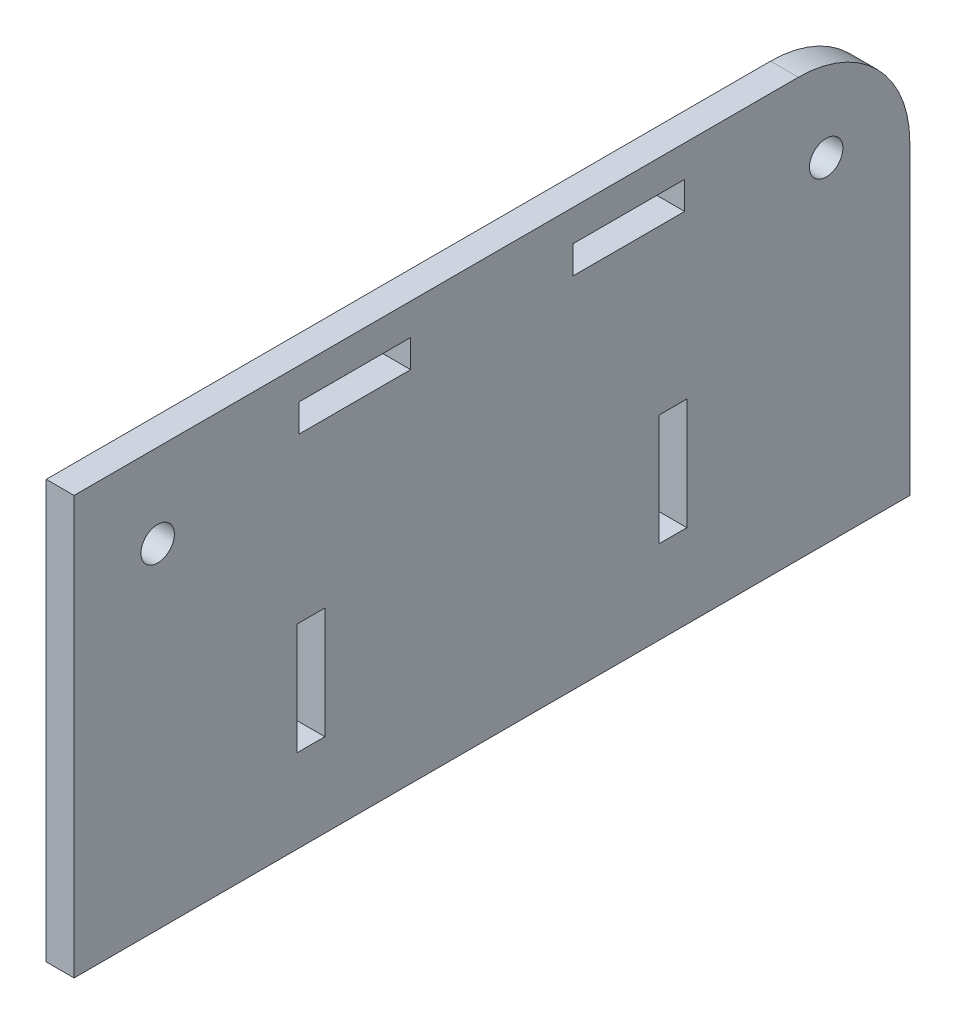
ISO-10303-21;
HEADER;
FILE_DESCRIPTION(('STEP AP214'),'2;1');
FILE_NAME('part.step','',(''),(''),'','','');
FILE_SCHEMA(('AUTOMOTIVE_DESIGN { 1 0 10303 214 1 1 1 1 }'));
ENDSEC;
DATA;
#1=APPLICATION_CONTEXT('core data for automotive mechanical design processes');
#2=APPLICATION_PROTOCOL_DEFINITION('international standard','automotive_design',2000,#1);
#3=PRODUCT_CONTEXT('',#1,'mechanical');
#4=PRODUCT('Part','Part','',(#3));
#5=PRODUCT_RELATED_PRODUCT_CATEGORY('part','',(#4));
#6=PRODUCT_DEFINITION_FORMATION('','',#4);
#7=PRODUCT_DEFINITION_CONTEXT('part definition',#1,'design');
#8=PRODUCT_DEFINITION('design','',#6,#7);
#9=PRODUCT_DEFINITION_SHAPE('','',#8);
#10=(LENGTH_UNIT() NAMED_UNIT(*) SI_UNIT(.MILLI.,.METRE.));
#11=(NAMED_UNIT(*) PLANE_ANGLE_UNIT() SI_UNIT($,.RADIAN.));
#12=(NAMED_UNIT(*) SI_UNIT($,.STERADIAN.) SOLID_ANGLE_UNIT());
#13=UNCERTAINTY_MEASURE_WITH_UNIT(LENGTH_MEASURE(1.E-05),#10,'distance_accuracy_value','');
#14=(GEOMETRIC_REPRESENTATION_CONTEXT(3) GLOBAL_UNCERTAINTY_ASSIGNED_CONTEXT((#13)) GLOBAL_UNIT_ASSIGNED_CONTEXT((#10,
#11,#12)) REPRESENTATION_CONTEXT('',''));
#15=CARTESIAN_POINT('',(0.,0.,0.));
#16=DIRECTION('',(0.,0.,1.));
#17=DIRECTION('',(1.,0.,0.));
#18=AXIS2_PLACEMENT_3D('',#15,#16,#17);
#19=CARTESIAN_POINT('',(5.,17.5106814537718,-24.6166503870736));
#20=DIRECTION('',(-1.,0.,0.));
#21=DIRECTION('',(0.,0.,1.));
#22=AXIS2_PLACEMENT_3D('',#19,#20,#21);
#23=PLANE('',#22);
#24=DIRECTION('',(0.,0.,-1.));
#25=VECTOR('',#24,1.);
#26=CARTESIAN_POINT('',(5.,26.8517441883896,44.981036282061));
#27=LINE('',#26,#25);
#28=CARTESIAN_POINT('',(5.,26.8517441883896,64.9867330574059));
#29=VERTEX_POINT('',#28);
#30=CARTESIAN_POINT('',(5.,26.8517441883896,44.981036282061));
#31=VERTEX_POINT('',#30);
#32=EDGE_CURVE('E214',#29,#31,#27,.T.);
#33=ORIENTED_EDGE('',*,*,#32,.F.);
#34=DIRECTION('',(0.,-1.,0.));
#35=VECTOR('',#34,1.);
#36=CARTESIAN_POINT('',(5.,26.8517441883896,64.9867330574059));
#37=LINE('',#36,#35);
#38=CARTESIAN_POINT('',(5.,31.8531683822259,64.986733057406));
#39=VERTEX_POINT('',#38);
#40=EDGE_CURVE('E222',#39,#29,#37,.T.);
#41=ORIENTED_EDGE('',*,*,#40,.F.);
#42=DIRECTION('',(0.,0.,1.));
#43=VECTOR('',#42,1.);
#44=CARTESIAN_POINT('',(5.,31.8531683822259,64.986733057406));
#45=LINE('',#44,#43);
#46=CARTESIAN_POINT('',(5.,31.8531683822259,44.981036282061));
#47=VERTEX_POINT('',#46);
#48=EDGE_CURVE('E219',#47,#39,#45,.T.);
#49=ORIENTED_EDGE('',*,*,#48,.F.);
#50=DIRECTION('',(0.,1.,0.));
#51=VECTOR('',#50,1.);
#52=CARTESIAN_POINT('',(5.,31.8531683822259,44.981036282061));
#53=LINE('',#52,#51);
#54=EDGE_CURVE('E216',#31,#47,#53,.T.);
#55=ORIENTED_EDGE('',*,*,#54,.F.);
#56=EDGE_LOOP('',(#33,#41,#49,#55));
#57=FACE_BOUND('',#56,.T.);
#58=DIRECTION('',(0.,0.,1.));
#59=VECTOR('',#58,1.);
#60=CARTESIAN_POINT('',(5.,-2.50071209691811,0.396167357452658));
#61=LINE('',#60,#59);
#62=CARTESIAN_POINT('',(5.,-2.50071209691811,-4.60525683638359));
#63=VERTEX_POINT('',#62);
#64=CARTESIAN_POINT('',(5.,-2.50071209691811,0.396167357452658));
#65=VERTEX_POINT('',#64);
#66=EDGE_CURVE('E282',#63,#65,#61,.T.);
#67=ORIENTED_EDGE('',*,*,#66,.F.);
#68=DIRECTION('',(0.,1.,0.));
#69=VECTOR('',#68,1.);
#70=CARTESIAN_POINT('',(5.,-2.50071209691811,-4.60525683638359));
#71=LINE('',#70,#69);
#72=CARTESIAN_POINT('',(5.,-22.5064088722631,-4.60525683638356));
#73=VERTEX_POINT('',#72);
#74=EDGE_CURVE('E290',#73,#63,#71,.T.);
#75=ORIENTED_EDGE('',*,*,#74,.F.);
#76=DIRECTION('',(0.,0.,-1.));
#77=VECTOR('',#76,1.);
#78=CARTESIAN_POINT('',(5.,-22.5064088722631,-4.60525683638356));
#79=LINE('',#78,#77);
#80=CARTESIAN_POINT('',(5.,-22.5064088722631,0.396167357452686));
#81=VERTEX_POINT('',#80);
#82=EDGE_CURVE('E287',#81,#73,#79,.T.);
#83=ORIENTED_EDGE('',*,*,#82,.F.);
#84=DIRECTION('',(0.,-1.,0.));
#85=VECTOR('',#84,1.);
#86=CARTESIAN_POINT('',(5.,-22.5064088722631,0.396167357452686));
#87=LINE('',#86,#85);
#88=EDGE_CURVE('E284',#65,#81,#87,.T.);
#89=ORIENTED_EDGE('',*,*,#88,.F.);
#90=EDGE_LOOP('',(#67,#75,#83,#89));
#91=FACE_BOUND('',#90,.T.);
#92=CARTESIAN_POINT('',(5.,17.5106814537718,-24.6166503870736));
#93=DIRECTION('',(1.,0.,0.));
#94=DIRECTION('',(0.,0.,1.));
#95=AXIS2_PLACEMENT_3D('',#92,#93,#94);
#96=CIRCLE('',#95,20.);
#97=CARTESIAN_POINT('',(5.,17.5106814537717,-44.6166503870735));
#98=VERTEX_POINT('',#97);
#99=CARTESIAN_POINT('',(5.,37.5106814537718,-24.6166503870734));
#100=VERTEX_POINT('',#99);
#101=EDGE_CURVE('E319',#98,#100,#96,.T.);
#102=ORIENTED_EDGE('',*,*,#101,.T.);
#103=DIRECTION('',(0.,0.,1.));
#104=VECTOR('',#103,1.);
#105=CARTESIAN_POINT('',(5.,37.5106814537718,-24.6166503870734));
#106=LINE('',#105,#104);
#107=CARTESIAN_POINT('',(5.,37.5106814537718,105.391894775944));
#108=VERTEX_POINT('',#107);
#109=EDGE_CURVE('E322',#100,#108,#106,.T.);
#110=ORIENTED_EDGE('',*,*,#109,.T.);
#111=DIRECTION('',(0.,-1.,0.));
#112=VECTOR('',#111,1.);
#113=CARTESIAN_POINT('',(5.,-37.5106814537718,105.391894775944));
#114=LINE('',#113,#112);
#115=CARTESIAN_POINT('',(5.,-37.5106814537718,105.391894775944));
#116=VERTEX_POINT('',#115);
#117=EDGE_CURVE('E325',#108,#116,#114,.T.);
#118=ORIENTED_EDGE('',*,*,#117,.T.);
#119=DIRECTION('',(0.,0.,-1.));
#120=VECTOR('',#119,1.);
#121=CARTESIAN_POINT('',(5.,-37.5106814537718,105.391894775944));
#122=LINE('',#121,#120);
#123=CARTESIAN_POINT('',(5.,-37.5106814537718,-44.6166503870735));
#124=VERTEX_POINT('',#123);
#125=EDGE_CURVE('E327',#116,#124,#122,.T.);
#126=ORIENTED_EDGE('',*,*,#125,.T.);
#127=DIRECTION('',(0.,1.,0.));
#128=VECTOR('',#127,1.);
#129=CARTESIAN_POINT('',(5.,-37.5106814537718,-44.6166503870735));
#130=LINE('',#129,#128);
#131=EDGE_CURVE('E329',#124,#98,#130,.T.);
#132=ORIENTED_EDGE('',*,*,#131,.T.);
#133=EDGE_LOOP('',(#102,#110,#118,#126,#132));
#134=FACE_BOUND('',#133,.T.);
#135=CARTESIAN_POINT('',(5.,22.5064088722631,-29.6123778055648));
#136=DIRECTION('',(1.,0.,0.));
#137=DIRECTION('',(0.,0.,-1.));
#138=AXIS2_PLACEMENT_3D('',#135,#136,#137);
#139=CIRCLE('',#138,3.00085451630174);
#140=CARTESIAN_POINT('',(5.,22.5064088722631,-32.6132323218665));
#141=VERTEX_POINT('',#140);
#142=EDGE_CURVE('E313',#141,#141,#139,.T.);
#143=ORIENTED_EDGE('',*,*,#142,.F.);
#144=EDGE_LOOP('',(#143));
#145=FACE_BOUND('',#144,.T.);
#146=DIRECTION('',(0.,0.,1.));
#147=VECTOR('',#146,1.);
#148=CARTESIAN_POINT('',(5.,31.8531683822259,-4.2114886685356));
#149=LINE('',#148,#147);
#150=CARTESIAN_POINT('',(5.,31.8531683822259,-4.2114886685356));
#151=VERTEX_POINT('',#150);
#152=CARTESIAN_POINT('',(5.,31.8531683822259,15.7942081068094));
#153=VERTEX_POINT('',#152);
#154=EDGE_CURVE('E251',#151,#153,#149,.T.);
#155=ORIENTED_EDGE('',*,*,#154,.F.);
#156=DIRECTION('',(0.,1.,0.));
#157=VECTOR('',#156,1.);
#158=CARTESIAN_POINT('',(5.,26.8517441883896,-4.21148866853557));
#159=LINE('',#158,#157);
#160=CARTESIAN_POINT('',(5.,26.8517441883896,-4.21148866853557));
#161=VERTEX_POINT('',#160);
#162=EDGE_CURVE('E259',#161,#151,#159,.T.);
#163=ORIENTED_EDGE('',*,*,#162,.F.);
#164=DIRECTION('',(0.,0.,-1.));
#165=VECTOR('',#164,1.);
#166=CARTESIAN_POINT('',(5.,26.8517441883896,15.7942081068094));
#167=LINE('',#166,#165);
#168=CARTESIAN_POINT('',(5.,26.8517441883896,15.7942081068094));
#169=VERTEX_POINT('',#168);
#170=EDGE_CURVE('E256',#169,#161,#167,.T.);
#171=ORIENTED_EDGE('',*,*,#170,.F.);
#172=DIRECTION('',(0.,-1.,0.));
#173=VECTOR('',#172,1.);
#174=CARTESIAN_POINT('',(5.,31.8531683822259,15.7942081068094));
#175=LINE('',#174,#173);
#176=EDGE_CURVE('E253',#153,#169,#175,.T.);
#177=ORIENTED_EDGE('',*,*,#176,.F.);
#178=EDGE_LOOP('',(#155,#163,#171,#177));
#179=FACE_BOUND('',#178,.T.);
#180=CARTESIAN_POINT('',(5.,22.5064088722631,90.3876221944352));
#181=DIRECTION('',(1.,0.,0.));
#182=DIRECTION('',(0.,0.,1.));
#183=AXIS2_PLACEMENT_3D('',#180,#181,#182);
#184=CIRCLE('',#183,3.00085451630174);
#185=CARTESIAN_POINT('',(5.,22.5064088722631,93.3884767107369));
#186=VERTEX_POINT('',#185);
#187=EDGE_CURVE('E245',#186,#186,#184,.T.);
#188=ORIENTED_EDGE('',*,*,#187,.F.);
#189=EDGE_LOOP('',(#188));
#190=FACE_BOUND('',#189,.T.);
#191=DIRECTION('',(0.,1.,0.));
#192=VECTOR('',#191,1.);
#193=CARTESIAN_POINT('',(5.,-22.5064088722631,60.3790770314177));
#194=LINE('',#193,#192);
#195=CARTESIAN_POINT('',(5.,-22.5064088722631,60.3790770314177));
#196=VERTEX_POINT('',#195);
#197=CARTESIAN_POINT('',(5.,-2.50071209691811,60.3790770314177));
#198=VERTEX_POINT('',#197);
#199=EDGE_CURVE('E178',#196,#198,#194,.T.);
#200=ORIENTED_EDGE('',*,*,#199,.F.);
#201=DIRECTION('',(0.,0.,-1.));
#202=VECTOR('',#201,1.);
#203=CARTESIAN_POINT('',(5.,-22.5064088722631,65.3805012252539));
#204=LINE('',#203,#202);
#205=CARTESIAN_POINT('',(5.,-22.5064088722631,65.3805012252539));
#206=VERTEX_POINT('',#205);
#207=EDGE_CURVE('E200',#206,#196,#204,.T.);
#208=ORIENTED_EDGE('',*,*,#207,.F.);
#209=DIRECTION('',(0.,-1.,0.));
#210=VECTOR('',#209,1.);
#211=CARTESIAN_POINT('',(5.,-2.50071209691811,65.380501225254));
#212=LINE('',#211,#210);
#213=CARTESIAN_POINT('',(5.,-2.50071209691811,65.380501225254));
#214=VERTEX_POINT('',#213);
#215=EDGE_CURVE('E198',#214,#206,#212,.T.);
#216=ORIENTED_EDGE('',*,*,#215,.F.);
#217=DIRECTION('',(0.,0.,1.));
#218=VECTOR('',#217,1.);
#219=CARTESIAN_POINT('',(5.,-2.50071209691811,60.3790770314177));
#220=LINE('',#219,#218);
#221=EDGE_CURVE('E186',#198,#214,#220,.T.);
#222=ORIENTED_EDGE('',*,*,#221,.F.);
#223=EDGE_LOOP('',(#200,#208,#216,#222));
#224=FACE_BOUND('',#223,.T.);
#225=ADVANCED_FACE('F35',(#57,#91,#134,#145,#179,#190,#224),#23,.F.);
#226=CARTESIAN_POINT('',(0.,17.5106814537718,-24.6166503870736));
#227=DIRECTION('',(-1.,0.,0.));
#228=DIRECTION('',(0.,0.,1.));
#229=AXIS2_PLACEMENT_3D('',#226,#227,#228);
#230=PLANE('',#229);
#231=DIRECTION('',(0.,1.,0.));
#232=VECTOR('',#231,1.);
#233=CARTESIAN_POINT('',(0.,26.8517441883896,-4.21148866853557));
#234=LINE('',#233,#232);
#235=CARTESIAN_POINT('',(0.,26.8517441883896,-4.21148866853557));
#236=VERTEX_POINT('',#235);
#237=CARTESIAN_POINT('',(0.,31.8531683822259,-4.2114886685356));
#238=VERTEX_POINT('',#237);
#239=EDGE_CURVE('E254',#236,#238,#234,.T.);
#240=ORIENTED_EDGE('',*,*,#239,.T.);
#241=DIRECTION('',(0.,0.,1.));
#242=VECTOR('',#241,1.);
#243=CARTESIAN_POINT('',(0.,31.8531683822259,-4.2114886685356));
#244=LINE('',#243,#242);
#245=CARTESIAN_POINT('',(0.,31.8531683822259,15.7942081068094));
#246=VERTEX_POINT('',#245);
#247=EDGE_CURVE('E248',#238,#246,#244,.T.);
#248=ORIENTED_EDGE('',*,*,#247,.T.);
#249=DIRECTION('',(0.,-1.,0.));
#250=VECTOR('',#249,1.);
#251=CARTESIAN_POINT('',(0.,31.8531683822259,15.7942081068094));
#252=LINE('',#251,#250);
#253=CARTESIAN_POINT('',(0.,26.8517441883896,15.7942081068094));
#254=VERTEX_POINT('',#253);
#255=EDGE_CURVE('E264',#246,#254,#252,.T.);
#256=ORIENTED_EDGE('',*,*,#255,.T.);
#257=DIRECTION('',(0.,0.,-1.));
#258=VECTOR('',#257,1.);
#259=CARTESIAN_POINT('',(0.,26.8517441883896,15.7942081068094));
#260=LINE('',#259,#258);
#261=EDGE_CURVE('E267',#254,#236,#260,.T.);
#262=ORIENTED_EDGE('',*,*,#261,.T.);
#263=EDGE_LOOP('',(#240,#248,#256,#262));
#264=FACE_BOUND('',#263,.T.);
#265=DIRECTION('',(0.,1.,0.));
#266=VECTOR('',#265,1.);
#267=CARTESIAN_POINT('',(0.,-2.50071209691811,-4.60525683638359));
#268=LINE('',#267,#266);
#269=CARTESIAN_POINT('',(0.,-22.5064088722631,-4.60525683638356));
#270=VERTEX_POINT('',#269);
#271=CARTESIAN_POINT('',(0.,-2.50071209691811,-4.60525683638359));
#272=VERTEX_POINT('',#271);
#273=EDGE_CURVE('E285',#270,#272,#268,.T.);
#274=ORIENTED_EDGE('',*,*,#273,.T.);
#275=DIRECTION('',(0.,0.,1.));
#276=VECTOR('',#275,1.);
#277=CARTESIAN_POINT('',(0.,-2.50071209691811,0.396167357452658));
#278=LINE('',#277,#276);
#279=CARTESIAN_POINT('',(0.,-2.50071209691811,0.396167357452658));
#280=VERTEX_POINT('',#279);
#281=EDGE_CURVE('E281',#272,#280,#278,.T.);
#282=ORIENTED_EDGE('',*,*,#281,.T.);
#283=DIRECTION('',(0.,-1.,0.));
#284=VECTOR('',#283,1.);
#285=CARTESIAN_POINT('',(0.,-22.5064088722631,0.396167357452686));
#286=LINE('',#285,#284);
#287=CARTESIAN_POINT('',(0.,-22.5064088722631,0.396167357452686));
#288=VERTEX_POINT('',#287);
#289=EDGE_CURVE('E295',#280,#288,#286,.T.);
#290=ORIENTED_EDGE('',*,*,#289,.T.);
#291=DIRECTION('',(0.,0.,-1.));
#292=VECTOR('',#291,1.);
#293=CARTESIAN_POINT('',(0.,-22.5064088722631,-4.60525683638356));
#294=LINE('',#293,#292);
#295=EDGE_CURVE('E298',#288,#270,#294,.T.);
#296=ORIENTED_EDGE('',*,*,#295,.T.);
#297=EDGE_LOOP('',(#274,#282,#290,#296));
#298=FACE_BOUND('',#297,.T.);
#299=CARTESIAN_POINT('',(0.,22.5064088722631,-29.6123778055648));
#300=DIRECTION('',(1.,0.,0.));
#301=DIRECTION('',(0.,0.,-1.));
#302=AXIS2_PLACEMENT_3D('',#299,#300,#301);
#303=CIRCLE('',#302,3.00085451630174);
#304=CARTESIAN_POINT('',(0.,22.5064088722631,-32.6132323218665));
#305=VERTEX_POINT('',#304);
#306=EDGE_CURVE('E312',#305,#305,#303,.T.);
#307=ORIENTED_EDGE('',*,*,#306,.T.);
#308=EDGE_LOOP('',(#307));
#309=FACE_BOUND('',#308,.T.);
#310=CARTESIAN_POINT('',(0.,17.5106814537718,-24.6166503870736));
#311=DIRECTION('',(1.,0.,0.));
#312=DIRECTION('',(0.,0.,1.));
#313=AXIS2_PLACEMENT_3D('',#310,#311,#312);
#314=CIRCLE('',#313,20.);
#315=CARTESIAN_POINT('',(0.,17.5106814537717,-44.6166503870735));
#316=VERTEX_POINT('',#315);
#317=CARTESIAN_POINT('',(0.,37.5106814537718,-24.6166503870734));
#318=VERTEX_POINT('',#317);
#319=EDGE_CURVE('E316',#316,#318,#314,.T.);
#320=ORIENTED_EDGE('',*,*,#319,.F.);
#321=DIRECTION('',(0.,1.,0.));
#322=VECTOR('',#321,1.);
#323=CARTESIAN_POINT('',(0.,-37.5106814537718,-44.6166503870735));
#324=LINE('',#323,#322);
#325=CARTESIAN_POINT('',(0.,-37.5106814537718,-44.6166503870735));
#326=VERTEX_POINT('',#325);
#327=EDGE_CURVE('E323',#326,#316,#324,.T.);
#328=ORIENTED_EDGE('',*,*,#327,.F.);
#329=DIRECTION('',(0.,0.,-1.));
#330=VECTOR('',#329,1.);
#331=CARTESIAN_POINT('',(0.,-37.5106814537718,105.391894775944));
#332=LINE('',#331,#330);
#333=CARTESIAN_POINT('',(0.,-37.5106814537718,105.391894775944));
#334=VERTEX_POINT('',#333);
#335=EDGE_CURVE('E338',#334,#326,#332,.T.);
#336=ORIENTED_EDGE('',*,*,#335,.F.);
#337=DIRECTION('',(0.,-1.,0.));
#338=VECTOR('',#337,1.);
#339=CARTESIAN_POINT('',(0.,-37.5106814537718,105.391894775944));
#340=LINE('',#339,#338);
#341=CARTESIAN_POINT('',(0.,37.5106814537718,105.391894775944));
#342=VERTEX_POINT('',#341);
#343=EDGE_CURVE('E336',#342,#334,#340,.T.);
#344=ORIENTED_EDGE('',*,*,#343,.F.);
#345=DIRECTION('',(0.,0.,1.));
#346=VECTOR('',#345,1.);
#347=CARTESIAN_POINT('',(0.,37.5106814537718,-24.6166503870734));
#348=LINE('',#347,#346);
#349=EDGE_CURVE('E334',#318,#342,#348,.T.);
#350=ORIENTED_EDGE('',*,*,#349,.F.);
#351=EDGE_LOOP('',(#320,#328,#336,#344,#350));
#352=FACE_BOUND('',#351,.T.);
#353=CARTESIAN_POINT('',(0.,22.5064088722631,90.3876221944352));
#354=DIRECTION('',(1.,0.,0.));
#355=DIRECTION('',(0.,0.,1.));
#356=AXIS2_PLACEMENT_3D('',#353,#354,#355);
#357=CIRCLE('',#356,3.00085451630174);
#358=CARTESIAN_POINT('',(0.,22.5064088722631,93.3884767107369));
#359=VERTEX_POINT('',#358);
#360=EDGE_CURVE('E244',#359,#359,#357,.T.);
#361=ORIENTED_EDGE('',*,*,#360,.T.);
#362=EDGE_LOOP('',(#361));
#363=FACE_BOUND('',#362,.T.);
#364=DIRECTION('',(0.,-1.,0.));
#365=VECTOR('',#364,1.);
#366=CARTESIAN_POINT('',(0.,26.8517441883896,64.9867330574059));
#367=LINE('',#366,#365);
#368=CARTESIAN_POINT('',(0.,31.8531683822259,64.986733057406));
#369=VERTEX_POINT('',#368);
#370=CARTESIAN_POINT('',(0.,26.8517441883896,64.9867330574059));
#371=VERTEX_POINT('',#370);
#372=EDGE_CURVE('E217',#369,#371,#367,.T.);
#373=ORIENTED_EDGE('',*,*,#372,.T.);
#374=DIRECTION('',(0.,0.,-1.));
#375=VECTOR('',#374,1.);
#376=CARTESIAN_POINT('',(0.,26.8517441883896,44.981036282061));
#377=LINE('',#376,#375);
#378=CARTESIAN_POINT('',(0.,26.8517441883896,44.981036282061));
#379=VERTEX_POINT('',#378);
#380=EDGE_CURVE('E194',#371,#379,#377,.T.);
#381=ORIENTED_EDGE('',*,*,#380,.T.);
#382=DIRECTION('',(0.,1.,0.));
#383=VECTOR('',#382,1.);
#384=CARTESIAN_POINT('',(0.,31.8531683822259,44.981036282061));
#385=LINE('',#384,#383);
#386=CARTESIAN_POINT('',(0.,31.8531683822259,44.981036282061));
#387=VERTEX_POINT('',#386);
#388=EDGE_CURVE('E227',#379,#387,#385,.T.);
#389=ORIENTED_EDGE('',*,*,#388,.T.);
#390=DIRECTION('',(0.,0.,1.));
#391=VECTOR('',#390,1.);
#392=CARTESIAN_POINT('',(0.,31.8531683822259,64.986733057406));
#393=LINE('',#392,#391);
#394=EDGE_CURVE('E230',#387,#369,#393,.T.);
#395=ORIENTED_EDGE('',*,*,#394,.T.);
#396=EDGE_LOOP('',(#373,#381,#389,#395));
#397=FACE_BOUND('',#396,.T.);
#398=DIRECTION('',(0.,0.,-1.));
#399=VECTOR('',#398,1.);
#400=CARTESIAN_POINT('',(0.,-22.5064088722631,65.3805012252539));
#401=LINE('',#400,#399);
#402=CARTESIAN_POINT('',(0.,-22.5064088722631,65.3805012252539));
#403=VERTEX_POINT('',#402);
#404=CARTESIAN_POINT('',(0.,-22.5064088722631,60.3790770314177));
#405=VERTEX_POINT('',#404);
#406=EDGE_CURVE('E187',#403,#405,#401,.T.);
#407=ORIENTED_EDGE('',*,*,#406,.T.);
#408=DIRECTION('',(0.,1.,0.));
#409=VECTOR('',#408,1.);
#410=CARTESIAN_POINT('',(0.,-22.5064088722631,60.3790770314177));
#411=LINE('',#410,#409);
#412=CARTESIAN_POINT('',(0.,-2.50071209691811,60.3790770314177));
#413=VERTEX_POINT('',#412);
#414=EDGE_CURVE('E58',#405,#413,#411,.T.);
#415=ORIENTED_EDGE('',*,*,#414,.T.);
#416=DIRECTION('',(0.,0.,1.));
#417=VECTOR('',#416,1.);
#418=CARTESIAN_POINT('',(0.,-2.50071209691811,60.3790770314177));
#419=LINE('',#418,#417);
#420=CARTESIAN_POINT('',(0.,-2.50071209691811,65.380501225254));
#421=VERTEX_POINT('',#420);
#422=EDGE_CURVE('E193',#413,#421,#419,.T.);
#423=ORIENTED_EDGE('',*,*,#422,.T.);
#424=DIRECTION('',(0.,-1.,0.));
#425=VECTOR('',#424,1.);
#426=CARTESIAN_POINT('',(0.,-2.50071209691811,65.380501225254));
#427=LINE('',#426,#425);
#428=EDGE_CURVE('E206',#421,#403,#427,.T.);
#429=ORIENTED_EDGE('',*,*,#428,.T.);
#430=EDGE_LOOP('',(#407,#415,#423,#429));
#431=FACE_BOUND('',#430,.T.);
#432=ADVANCED_FACE('F359',(#264,#298,#309,#352,#363,#397,#431),#230,.T.);
#433=CARTESIAN_POINT('',(5.,17.5106814537718,-24.6166503870736));
#434=DIRECTION('',(-1.,0.,0.));
#435=DIRECTION('',(0.,0.,1.));
#436=AXIS2_PLACEMENT_3D('',#433,#434,#435);
#437=CYLINDRICAL_SURFACE('',#436,20.);
#438=ORIENTED_EDGE('',*,*,#319,.T.);
#439=DIRECTION('',(-1.,0.,0.));
#440=VECTOR('',#439,1.);
#441=CARTESIAN_POINT('',(5.,37.5106814537718,-24.6166503870734));
#442=LINE('',#441,#440);
#443=EDGE_CURVE('E11',#100,#318,#442,.T.);
#444=ORIENTED_EDGE('',*,*,#443,.F.);
#445=ORIENTED_EDGE('',*,*,#101,.F.);
#446=DIRECTION('',(-1.,0.,0.));
#447=VECTOR('',#446,1.);
#448=CARTESIAN_POINT('',(5.,17.5106814537717,-44.6166503870735));
#449=LINE('',#448,#447);
#450=EDGE_CURVE('E331',#98,#316,#449,.T.);
#451=ORIENTED_EDGE('',*,*,#450,.T.);
#452=EDGE_LOOP('',(#438,#444,#445,#451));
#453=FACE_BOUND('',#452,.T.);
#454=ADVANCED_FACE('F37',(#453),#437,.T.);
#455=CARTESIAN_POINT('',(5.,37.5106814537718,-24.6166503870734));
#456=DIRECTION('',(0.,-1.,0.));
#457=DIRECTION('',(0.,0.,-1.));
#458=AXIS2_PLACEMENT_3D('',#455,#456,#457);
#459=PLANE('',#458);
#460=ORIENTED_EDGE('',*,*,#349,.T.);
#461=DIRECTION('',(-1.,0.,0.));
#462=VECTOR('',#461,1.);
#463=CARTESIAN_POINT('',(5.,37.5106814537718,105.391894775944));
#464=LINE('',#463,#462);
#465=EDGE_CURVE('E43',#108,#342,#464,.T.);
#466=ORIENTED_EDGE('',*,*,#465,.F.);
#467=ORIENTED_EDGE('',*,*,#109,.F.);
#468=ORIENTED_EDGE('',*,*,#443,.T.);
#469=EDGE_LOOP('',(#460,#466,#467,#468));
#470=FACE_BOUND('',#469,.T.);
#471=ADVANCED_FACE('F374',(#470),#459,.F.);
#472=CARTESIAN_POINT('',(5.,-37.5106814537718,105.391894775944));
#473=DIRECTION('',(0.,0.,-1.));
#474=DIRECTION('',(-1.,0.,0.));
#475=AXIS2_PLACEMENT_3D('',#472,#473,#474);
#476=PLANE('',#475);
#477=ORIENTED_EDGE('',*,*,#343,.T.);
#478=DIRECTION('',(-1.,0.,0.));
#479=VECTOR('',#478,1.);
#480=CARTESIAN_POINT('',(5.,-37.5106814537718,105.391894775944));
#481=LINE('',#480,#479);
#482=EDGE_CURVE('E346',#116,#334,#481,.T.);
#483=ORIENTED_EDGE('',*,*,#482,.F.);
#484=ORIENTED_EDGE('',*,*,#117,.F.);
#485=ORIENTED_EDGE('',*,*,#465,.T.);
#486=EDGE_LOOP('',(#477,#483,#484,#485));
#487=FACE_BOUND('',#486,.T.);
#488=ADVANCED_FACE('F353',(#487),#476,.F.);
#489=CARTESIAN_POINT('',(5.,-37.5106814537718,105.391894775944));
#490=DIRECTION('',(0.,1.,0.));
#491=DIRECTION('',(0.,0.,1.));
#492=AXIS2_PLACEMENT_3D('',#489,#490,#491);
#493=PLANE('',#492);
#494=ORIENTED_EDGE('',*,*,#335,.T.);
#495=DIRECTION('',(-1.,0.,0.));
#496=VECTOR('',#495,1.);
#497=CARTESIAN_POINT('',(5.,-37.5106814537718,-44.6166503870735));
#498=LINE('',#497,#496);
#499=EDGE_CURVE('E343',#124,#326,#498,.T.);
#500=ORIENTED_EDGE('',*,*,#499,.F.);
#501=ORIENTED_EDGE('',*,*,#125,.F.);
#502=ORIENTED_EDGE('',*,*,#482,.T.);
#503=EDGE_LOOP('',(#494,#500,#501,#502));
#504=FACE_BOUND('',#503,.T.);
#505=ADVANCED_FACE('F364',(#504),#493,.F.);
#506=CARTESIAN_POINT('',(5.,-37.5106814537718,-44.6166503870735));
#507=DIRECTION('',(0.,0.,1.));
#508=DIRECTION('',(1.,0.,0.));
#509=AXIS2_PLACEMENT_3D('',#506,#507,#508);
#510=PLANE('',#509);
#511=ORIENTED_EDGE('',*,*,#327,.T.);
#512=ORIENTED_EDGE('',*,*,#450,.F.);
#513=ORIENTED_EDGE('',*,*,#131,.F.);
#514=ORIENTED_EDGE('',*,*,#499,.T.);
#515=EDGE_LOOP('',(#511,#512,#513,#514));
#516=FACE_BOUND('',#515,.T.);
#517=ADVANCED_FACE('F368',(#516),#510,.F.);
#518=CARTESIAN_POINT('',(5.,22.5064088722631,-29.6123778055648));
#519=DIRECTION('',(-1.,0.,0.));
#520=DIRECTION('',(0.,0.,1.));
#521=AXIS2_PLACEMENT_3D('',#518,#519,#520);
#522=CYLINDRICAL_SURFACE('',#521,3.00085451630174);
#523=ORIENTED_EDGE('',*,*,#142,.T.);
#524=EDGE_LOOP('',(#523));
#525=FACE_BOUND('',#524,.T.);
#526=ORIENTED_EDGE('',*,*,#306,.F.);
#527=EDGE_LOOP('',(#526));
#528=FACE_BOUND('',#527,.T.);
#529=ADVANCED_FACE('F391',(#525,#528),#522,.F.);
#530=CARTESIAN_POINT('',(5.,-2.50071209691811,0.396167357452658));
#531=DIRECTION('',(0.,-1.,0.));
#532=DIRECTION('',(0.,0.,-1.));
#533=AXIS2_PLACEMENT_3D('',#530,#531,#532);
#534=PLANE('',#533);
#535=ORIENTED_EDGE('',*,*,#281,.F.);
#536=DIRECTION('',(-1.,0.,0.));
#537=VECTOR('',#536,1.);
#538=CARTESIAN_POINT('',(5.,-2.50071209691811,-4.60525683638359));
#539=LINE('',#538,#537);
#540=EDGE_CURVE('E292',#63,#272,#539,.T.);
#541=ORIENTED_EDGE('',*,*,#540,.F.);
#542=ORIENTED_EDGE('',*,*,#66,.T.);
#543=DIRECTION('',(-1.,0.,0.));
#544=VECTOR('',#543,1.);
#545=CARTESIAN_POINT('',(5.,-2.50071209691811,0.396167357452658));
#546=LINE('',#545,#544);
#547=EDGE_CURVE('E309',#65,#280,#546,.T.);
#548=ORIENTED_EDGE('',*,*,#547,.T.);
#549=EDGE_LOOP('',(#535,#541,#542,#548));
#550=FACE_BOUND('',#549,.T.);
#551=ADVANCED_FACE('F417',(#550),#534,.T.);
#552=CARTESIAN_POINT('',(5.,-22.5064088722631,0.396167357452686));
#553=DIRECTION('',(0.,0.,-1.));
#554=DIRECTION('',(0.,1.,0.));
#555=AXIS2_PLACEMENT_3D('',#552,#553,#554);
#556=PLANE('',#555);
#557=ORIENTED_EDGE('',*,*,#289,.F.);
#558=ORIENTED_EDGE('',*,*,#547,.F.);
#559=ORIENTED_EDGE('',*,*,#88,.T.);
#560=DIRECTION('',(-1.,0.,0.));
#561=VECTOR('',#560,1.);
#562=CARTESIAN_POINT('',(5.,-22.5064088722631,0.396167357452686));
#563=LINE('',#562,#561);
#564=EDGE_CURVE('E307',#81,#288,#563,.T.);
#565=ORIENTED_EDGE('',*,*,#564,.T.);
#566=EDGE_LOOP('',(#557,#558,#559,#565));
#567=FACE_BOUND('',#566,.T.);
#568=ADVANCED_FACE('F424',(#567),#556,.T.);
#569=CARTESIAN_POINT('',(5.,-22.5064088722631,-4.60525683638356));
#570=DIRECTION('',(0.,1.,0.));
#571=DIRECTION('',(0.,0.,1.));
#572=AXIS2_PLACEMENT_3D('',#569,#570,#571);
#573=PLANE('',#572);
#574=ORIENTED_EDGE('',*,*,#295,.F.);
#575=ORIENTED_EDGE('',*,*,#564,.F.);
#576=ORIENTED_EDGE('',*,*,#82,.T.);
#577=DIRECTION('',(-1.,0.,0.));
#578=VECTOR('',#577,1.);
#579=CARTESIAN_POINT('',(5.,-22.5064088722631,-4.60525683638356));
#580=LINE('',#579,#578);
#581=EDGE_CURVE('E305',#73,#270,#580,.T.);
#582=ORIENTED_EDGE('',*,*,#581,.T.);
#583=EDGE_LOOP('',(#574,#575,#576,#582));
#584=FACE_BOUND('',#583,.T.);
#585=ADVANCED_FACE('F431',(#584),#573,.T.);
#586=CARTESIAN_POINT('',(5.,-2.50071209691811,-4.60525683638359));
#587=DIRECTION('',(0.,0.,1.));
#588=DIRECTION('',(0.,-1.,0.));
#589=AXIS2_PLACEMENT_3D('',#586,#587,#588);
#590=PLANE('',#589);
#591=ORIENTED_EDGE('',*,*,#273,.F.);
#592=ORIENTED_EDGE('',*,*,#581,.F.);
#593=ORIENTED_EDGE('',*,*,#74,.T.);
#594=ORIENTED_EDGE('',*,*,#540,.T.);
#595=EDGE_LOOP('',(#591,#592,#593,#594));
#596=FACE_BOUND('',#595,.T.);
#597=ADVANCED_FACE('F439',(#596),#590,.T.);
#598=CARTESIAN_POINT('',(5.,31.8531683822259,-4.2114886685356));
#599=DIRECTION('',(0.,-1.,0.));
#600=DIRECTION('',(0.,0.,-1.));
#601=AXIS2_PLACEMENT_3D('',#598,#599,#600);
#602=PLANE('',#601);
#603=ORIENTED_EDGE('',*,*,#247,.F.);
#604=DIRECTION('',(-1.,0.,0.));
#605=VECTOR('',#604,1.);
#606=CARTESIAN_POINT('',(5.,31.8531683822259,-4.2114886685356));
#607=LINE('',#606,#605);
#608=EDGE_CURVE('E261',#151,#238,#607,.T.);
#609=ORIENTED_EDGE('',*,*,#608,.F.);
#610=ORIENTED_EDGE('',*,*,#154,.T.);
#611=DIRECTION('',(-1.,0.,0.));
#612=VECTOR('',#611,1.);
#613=CARTESIAN_POINT('',(5.,31.8531683822259,15.7942081068094));
#614=LINE('',#613,#612);
#615=EDGE_CURVE('E278',#153,#246,#614,.T.);
#616=ORIENTED_EDGE('',*,*,#615,.T.);
#617=EDGE_LOOP('',(#603,#609,#610,#616));
#618=FACE_BOUND('',#617,.T.);
#619=ADVANCED_FACE('F447',(#618),#602,.T.);
#620=CARTESIAN_POINT('',(5.,31.8531683822259,15.7942081068094));
#621=DIRECTION('',(0.,0.,-1.));
#622=DIRECTION('',(-1.,0.,0.));
#623=AXIS2_PLACEMENT_3D('',#620,#621,#622);
#624=PLANE('',#623);
#625=ORIENTED_EDGE('',*,*,#255,.F.);
#626=ORIENTED_EDGE('',*,*,#615,.F.);
#627=ORIENTED_EDGE('',*,*,#176,.T.);
#628=DIRECTION('',(-1.,0.,0.));
#629=VECTOR('',#628,1.);
#630=CARTESIAN_POINT('',(5.,26.8517441883896,15.7942081068094));
#631=LINE('',#630,#629);
#632=EDGE_CURVE('E276',#169,#254,#631,.T.);
#633=ORIENTED_EDGE('',*,*,#632,.T.);
#634=EDGE_LOOP('',(#625,#626,#627,#633));
#635=FACE_BOUND('',#634,.T.);
#636=ADVANCED_FACE('F455',(#635),#624,.T.);
#637=CARTESIAN_POINT('',(5.,26.8517441883896,15.7942081068094));
#638=DIRECTION('',(0.,1.,0.));
#639=DIRECTION('',(0.,0.,1.));
#640=AXIS2_PLACEMENT_3D('',#637,#638,#639);
#641=PLANE('',#640);
#642=ORIENTED_EDGE('',*,*,#261,.F.);
#643=ORIENTED_EDGE('',*,*,#632,.F.);
#644=ORIENTED_EDGE('',*,*,#170,.T.);
#645=DIRECTION('',(-1.,0.,0.));
#646=VECTOR('',#645,1.);
#647=CARTESIAN_POINT('',(5.,26.8517441883896,-4.21148866853557));
#648=LINE('',#647,#646);
#649=EDGE_CURVE('E274',#161,#236,#648,.T.);
#650=ORIENTED_EDGE('',*,*,#649,.T.);
#651=EDGE_LOOP('',(#642,#643,#644,#650));
#652=FACE_BOUND('',#651,.T.);
#653=ADVANCED_FACE('F463',(#652),#641,.T.);
#654=CARTESIAN_POINT('',(5.,26.8517441883896,-4.21148866853557));
#655=DIRECTION('',(0.,0.,1.));
#656=DIRECTION('',(0.,-1.,0.));
#657=AXIS2_PLACEMENT_3D('',#654,#655,#656);
#658=PLANE('',#657);
#659=ORIENTED_EDGE('',*,*,#239,.F.);
#660=ORIENTED_EDGE('',*,*,#649,.F.);
#661=ORIENTED_EDGE('',*,*,#162,.T.);
#662=ORIENTED_EDGE('',*,*,#608,.T.);
#663=EDGE_LOOP('',(#659,#660,#661,#662));
#664=FACE_BOUND('',#663,.T.);
#665=ADVANCED_FACE('F471',(#664),#658,.T.);
#666=CARTESIAN_POINT('',(5.,22.5064088722631,90.3876221944352));
#667=DIRECTION('',(-1.,0.,0.));
#668=DIRECTION('',(0.,0.,1.));
#669=AXIS2_PLACEMENT_3D('',#666,#667,#668);
#670=CYLINDRICAL_SURFACE('',#669,3.00085451630174);
#671=ORIENTED_EDGE('',*,*,#187,.T.);
#672=EDGE_LOOP('',(#671));
#673=FACE_BOUND('',#672,.T.);
#674=ORIENTED_EDGE('',*,*,#360,.F.);
#675=EDGE_LOOP('',(#674));
#676=FACE_BOUND('',#675,.T.);
#677=ADVANCED_FACE('F479',(#673,#676),#670,.F.);
#678=CARTESIAN_POINT('',(5.,26.8517441883896,44.981036282061));
#679=DIRECTION('',(0.,1.,0.));
#680=DIRECTION('',(0.,0.,1.));
#681=AXIS2_PLACEMENT_3D('',#678,#679,#680);
#682=PLANE('',#681);
#683=ORIENTED_EDGE('',*,*,#380,.F.);
#684=DIRECTION('',(-1.,0.,0.));
#685=VECTOR('',#684,1.);
#686=CARTESIAN_POINT('',(5.,26.8517441883896,64.9867330574059));
#687=LINE('',#686,#685);
#688=EDGE_CURVE('E224',#29,#371,#687,.T.);
#689=ORIENTED_EDGE('',*,*,#688,.F.);
#690=ORIENTED_EDGE('',*,*,#32,.T.);
#691=DIRECTION('',(-1.,0.,0.));
#692=VECTOR('',#691,1.);
#693=CARTESIAN_POINT('',(5.,26.8517441883896,44.981036282061));
#694=LINE('',#693,#692);
#695=EDGE_CURVE('E241',#31,#379,#694,.T.);
#696=ORIENTED_EDGE('',*,*,#695,.T.);
#697=EDGE_LOOP('',(#683,#689,#690,#696));
#698=FACE_BOUND('',#697,.T.);
#699=ADVANCED_FACE('F487',(#698),#682,.T.);
#700=CARTESIAN_POINT('',(5.,31.8531683822259,44.981036282061));
#701=DIRECTION('',(0.,0.,1.));
#702=DIRECTION('',(1.,0.,0.));
#703=AXIS2_PLACEMENT_3D('',#700,#701,#702);
#704=PLANE('',#703);
#705=ORIENTED_EDGE('',*,*,#388,.F.);
#706=ORIENTED_EDGE('',*,*,#695,.F.);
#707=ORIENTED_EDGE('',*,*,#54,.T.);
#708=DIRECTION('',(-1.,0.,0.));
#709=VECTOR('',#708,1.);
#710=CARTESIAN_POINT('',(5.,31.8531683822259,44.981036282061));
#711=LINE('',#710,#709);
#712=EDGE_CURVE('E239',#47,#387,#711,.T.);
#713=ORIENTED_EDGE('',*,*,#712,.T.);
#714=EDGE_LOOP('',(#705,#706,#707,#713));
#715=FACE_BOUND('',#714,.T.);
#716=ADVANCED_FACE('F495',(#715),#704,.T.);
#717=CARTESIAN_POINT('',(5.,31.8531683822259,64.986733057406));
#718=DIRECTION('',(0.,-1.,0.));
#719=DIRECTION('',(0.,0.,-1.));
#720=AXIS2_PLACEMENT_3D('',#717,#718,#719);
#721=PLANE('',#720);
#722=ORIENTED_EDGE('',*,*,#394,.F.);
#723=ORIENTED_EDGE('',*,*,#712,.F.);
#724=ORIENTED_EDGE('',*,*,#48,.T.);
#725=DIRECTION('',(-1.,0.,0.));
#726=VECTOR('',#725,1.);
#727=CARTESIAN_POINT('',(5.,31.8531683822259,64.986733057406));
#728=LINE('',#727,#726);
#729=EDGE_CURVE('E237',#39,#369,#728,.T.);
#730=ORIENTED_EDGE('',*,*,#729,.T.);
#731=EDGE_LOOP('',(#722,#723,#724,#730));
#732=FACE_BOUND('',#731,.T.);
#733=ADVANCED_FACE('F503',(#732),#721,.T.);
#734=CARTESIAN_POINT('',(5.,26.8517441883896,64.9867330574059));
#735=DIRECTION('',(0.,0.,-1.));
#736=DIRECTION('',(0.,1.,0.));
#737=AXIS2_PLACEMENT_3D('',#734,#735,#736);
#738=PLANE('',#737);
#739=ORIENTED_EDGE('',*,*,#372,.F.);
#740=ORIENTED_EDGE('',*,*,#729,.F.);
#741=ORIENTED_EDGE('',*,*,#40,.T.);
#742=ORIENTED_EDGE('',*,*,#688,.T.);
#743=EDGE_LOOP('',(#739,#740,#741,#742));
#744=FACE_BOUND('',#743,.T.);
#745=ADVANCED_FACE('F511',(#744),#738,.T.);
#746=CARTESIAN_POINT('',(5.,-22.5064088722631,60.3790770314177));
#747=DIRECTION('',(0.,0.,1.));
#748=DIRECTION('',(0.,-1.,0.));
#749=AXIS2_PLACEMENT_3D('',#746,#747,#748);
#750=PLANE('',#749);
#751=ORIENTED_EDGE('',*,*,#414,.F.);
#752=DIRECTION('',(-1.,0.,0.));
#753=VECTOR('',#752,1.);
#754=CARTESIAN_POINT('',(5.,-22.5064088722631,60.3790770314177));
#755=LINE('',#754,#753);
#756=EDGE_CURVE('E182',#196,#405,#755,.T.);
#757=ORIENTED_EDGE('',*,*,#756,.F.);
#758=ORIENTED_EDGE('',*,*,#199,.T.);
#759=DIRECTION('',(-1.,0.,0.));
#760=VECTOR('',#759,1.);
#761=CARTESIAN_POINT('',(5.,-2.50071209691811,60.3790770314177));
#762=LINE('',#761,#760);
#763=EDGE_CURVE('E181',#198,#413,#762,.T.);
#764=ORIENTED_EDGE('',*,*,#763,.T.);
#765=EDGE_LOOP('',(#751,#757,#758,#764));
#766=FACE_BOUND('',#765,.T.);
#767=ADVANCED_FACE('F180',(#766),#750,.T.);
#768=CARTESIAN_POINT('',(5.,-2.50071209691811,60.3790770314177));
#769=DIRECTION('',(0.,-1.,0.));
#770=DIRECTION('',(0.,0.,-1.));
#771=AXIS2_PLACEMENT_3D('',#768,#769,#770);
#772=PLANE('',#771);
#773=ORIENTED_EDGE('',*,*,#422,.F.);
#774=ORIENTED_EDGE('',*,*,#763,.F.);
#775=ORIENTED_EDGE('',*,*,#221,.T.);
#776=DIRECTION('',(-1.,0.,0.));
#777=VECTOR('',#776,1.);
#778=CARTESIAN_POINT('',(5.,-2.50071209691811,65.380501225254));
#779=LINE('',#778,#777);
#780=EDGE_CURVE('E195',#214,#421,#779,.T.);
#781=ORIENTED_EDGE('',*,*,#780,.T.);
#782=EDGE_LOOP('',(#773,#774,#775,#781));
#783=FACE_BOUND('',#782,.T.);
#784=ADVANCED_FACE('F190',(#783),#772,.T.);
#785=CARTESIAN_POINT('',(5.,-2.50071209691811,65.380501225254));
#786=DIRECTION('',(0.,0.,-1.));
#787=DIRECTION('',(0.,1.,0.));
#788=AXIS2_PLACEMENT_3D('',#785,#786,#787);
#789=PLANE('',#788);
#790=ORIENTED_EDGE('',*,*,#428,.F.);
#791=ORIENTED_EDGE('',*,*,#780,.F.);
#792=ORIENTED_EDGE('',*,*,#215,.T.);
#793=DIRECTION('',(-1.,0.,0.));
#794=VECTOR('',#793,1.);
#795=CARTESIAN_POINT('',(5.,-22.5064088722631,65.3805012252539));
#796=LINE('',#795,#794);
#797=EDGE_CURVE('E50',#206,#403,#796,.T.);
#798=ORIENTED_EDGE('',*,*,#797,.T.);
#799=EDGE_LOOP('',(#790,#791,#792,#798));
#800=FACE_BOUND('',#799,.T.);
#801=ADVANCED_FACE('F532',(#800),#789,.T.);
#802=CARTESIAN_POINT('',(5.,-22.5064088722631,65.3805012252539));
#803=DIRECTION('',(0.,1.,0.));
#804=DIRECTION('',(0.,0.,1.));
#805=AXIS2_PLACEMENT_3D('',#802,#803,#804);
#806=PLANE('',#805);
#807=ORIENTED_EDGE('',*,*,#406,.F.);
#808=ORIENTED_EDGE('',*,*,#797,.F.);
#809=ORIENTED_EDGE('',*,*,#207,.T.);
#810=ORIENTED_EDGE('',*,*,#756,.T.);
#811=EDGE_LOOP('',(#807,#808,#809,#810));
#812=FACE_BOUND('',#811,.T.);
#813=ADVANCED_FACE('F539',(#812),#806,.T.);
#814=CLOSED_SHELL('',(#225,#432,#454,#471,#488,#505,#517,#529,#551,#568,#585,#597,#619,#636,
#653,#665,#677,#699,#716,#733,#745,#767,#784,#801,#813));
#815=MANIFOLD_SOLID_BREP('B2',#814);
#816=ADVANCED_BREP_SHAPE_REPRESENTATION('',(#18,#815),#14);
#817=SHAPE_DEFINITION_REPRESENTATION(#9,#816);
ENDSEC;
END-ISO-10303-21;
